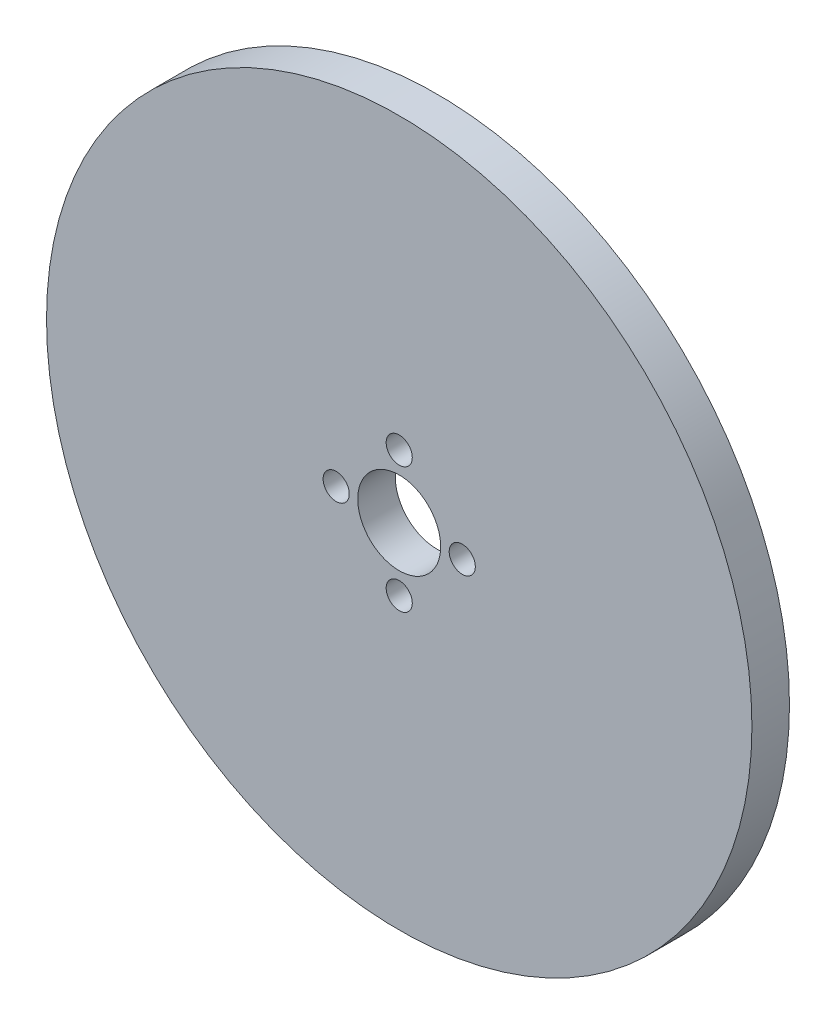
ISO-10303-21;
HEADER;
FILE_DESCRIPTION(('STEP AP214'),'2;1');
FILE_NAME('part.step','',(''),(''),'','','');
FILE_SCHEMA(('AUTOMOTIVE_DESIGN { 1 0 10303 214 1 1 1 1 }'));
ENDSEC;
DATA;
#1=APPLICATION_CONTEXT('core data for automotive mechanical design processes');
#2=APPLICATION_PROTOCOL_DEFINITION('international standard','automotive_design',2000,#1);
#3=PRODUCT_CONTEXT('',#1,'mechanical');
#4=PRODUCT('Part','Part','',(#3));
#5=PRODUCT_RELATED_PRODUCT_CATEGORY('part','',(#4));
#6=PRODUCT_DEFINITION_FORMATION('','',#4);
#7=PRODUCT_DEFINITION_CONTEXT('part definition',#1,'design');
#8=PRODUCT_DEFINITION('design','',#6,#7);
#9=PRODUCT_DEFINITION_SHAPE('','',#8);
#10=(LENGTH_UNIT() NAMED_UNIT(*) SI_UNIT(.MILLI.,.METRE.));
#11=(NAMED_UNIT(*) PLANE_ANGLE_UNIT() SI_UNIT($,.RADIAN.));
#12=(NAMED_UNIT(*) SI_UNIT($,.STERADIAN.) SOLID_ANGLE_UNIT());
#13=UNCERTAINTY_MEASURE_WITH_UNIT(LENGTH_MEASURE(1.E-05),#10,'distance_accuracy_value','');
#14=(GEOMETRIC_REPRESENTATION_CONTEXT(3) GLOBAL_UNCERTAINTY_ASSIGNED_CONTEXT((#13)) GLOBAL_UNIT_ASSIGNED_CONTEXT((#10,
#11,#12)) REPRESENTATION_CONTEXT('',''));
#15=CARTESIAN_POINT('',(0.,0.,0.));
#16=DIRECTION('',(0.,0.,1.));
#17=DIRECTION('',(1.,0.,0.));
#18=AXIS2_PLACEMENT_3D('',#15,#16,#17);
#19=CARTESIAN_POINT('',(0.,0.,-5.75));
#20=DIRECTION('',(0.,0.,1.));
#21=DIRECTION('',(1.,0.,0.));
#22=AXIS2_PLACEMENT_3D('',#19,#20,#21);
#23=CYLINDRICAL_SURFACE('',#22,54.);
#24=CARTESIAN_POINT('',(0.,0.,-5.75));
#25=DIRECTION('',(0.,0.,1.));
#26=DIRECTION('',(1.,0.,0.));
#27=AXIS2_PLACEMENT_3D('',#24,#25,#26);
#28=CIRCLE('',#27,54.);
#29=CARTESIAN_POINT('',(54.,0.,-5.75));
#30=VERTEX_POINT('',#29);
#31=EDGE_CURVE('E12',#30,#30,#28,.T.);
#32=ORIENTED_EDGE('',*,*,#31,.T.);
#33=EDGE_LOOP('',(#32));
#34=FACE_BOUND('',#33,.T.);
#35=CARTESIAN_POINT('',(0.,0.,0.));
#36=DIRECTION('',(0.,0.,1.));
#37=DIRECTION('',(1.,0.,0.));
#38=AXIS2_PLACEMENT_3D('',#35,#36,#37);
#39=CIRCLE('',#38,54.);
#40=CARTESIAN_POINT('',(54.,0.,0.));
#41=VERTEX_POINT('',#40);
#42=EDGE_CURVE('E79',#41,#41,#39,.T.);
#43=ORIENTED_EDGE('',*,*,#42,.F.);
#44=EDGE_LOOP('',(#43));
#45=FACE_BOUND('',#44,.T.);
#46=ADVANCED_FACE('F75',(#34,#45),#23,.T.);
#47=CARTESIAN_POINT('',(0.,0.,-5.75));
#48=DIRECTION('',(0.,0.,1.));
#49=DIRECTION('',(1.,0.,0.));
#50=AXIS2_PLACEMENT_3D('',#47,#48,#49);
#51=PLANE('',#50);
#52=CARTESIAN_POINT('',(0.,0.,-5.75));
#53=DIRECTION('',(0.,0.,-1.));
#54=DIRECTION('',(-1.,0.,0.));
#55=AXIS2_PLACEMENT_3D('',#52,#53,#54);
#56=CIRCLE('',#55,6.35);
#57=CARTESIAN_POINT('',(-6.35,0.,-5.75));
#58=VERTEX_POINT('',#57);
#59=EDGE_CURVE('E108',#58,#58,#56,.T.);
#60=ORIENTED_EDGE('',*,*,#59,.F.);
#61=EDGE_LOOP('',(#60));
#62=FACE_BOUND('',#61,.T.);
#63=CARTESIAN_POINT('',(9.64999999999999,0.,-5.75));
#64=DIRECTION('',(0.,0.,1.));
#65=DIRECTION('',(1.,0.,0.));
#66=AXIS2_PLACEMENT_3D('',#63,#64,#65);
#67=CIRCLE('',#66,2.);
#68=CARTESIAN_POINT('',(11.65,0.,-5.75));
#69=VERTEX_POINT('',#68);
#70=EDGE_CURVE('E123',#69,#69,#67,.T.);
#71=ORIENTED_EDGE('',*,*,#70,.T.);
#72=EDGE_LOOP('',(#71));
#73=FACE_BOUND('',#72,.T.);
#74=CARTESIAN_POINT('',(0.,-9.65,-5.75));
#75=DIRECTION('',(0.,0.,1.));
#76=DIRECTION('',(1.,0.,0.));
#77=AXIS2_PLACEMENT_3D('',#74,#75,#76);
#78=CIRCLE('',#77,2.);
#79=CARTESIAN_POINT('',(2.,-9.65,-5.75));
#80=VERTEX_POINT('',#79);
#81=EDGE_CURVE('E137',#80,#80,#78,.T.);
#82=ORIENTED_EDGE('',*,*,#81,.T.);
#83=EDGE_LOOP('',(#82));
#84=FACE_BOUND('',#83,.T.);
#85=CARTESIAN_POINT('',(0.,9.65,-5.75));
#86=DIRECTION('',(0.,0.,1.));
#87=DIRECTION('',(1.,0.,0.));
#88=AXIS2_PLACEMENT_3D('',#85,#86,#87);
#89=CIRCLE('',#88,2.);
#90=CARTESIAN_POINT('',(2.,9.65,-5.75));
#91=VERTEX_POINT('',#90);
#92=EDGE_CURVE('E139',#91,#91,#89,.T.);
#93=ORIENTED_EDGE('',*,*,#92,.T.);
#94=EDGE_LOOP('',(#93));
#95=FACE_BOUND('',#94,.T.);
#96=CARTESIAN_POINT('',(-9.65,0.,-5.75));
#97=DIRECTION('',(0.,0.,1.));
#98=DIRECTION('',(1.,0.,0.));
#99=AXIS2_PLACEMENT_3D('',#96,#97,#98);
#100=CIRCLE('',#99,2.);
#101=CARTESIAN_POINT('',(-7.65,0.,-5.75));
#102=VERTEX_POINT('',#101);
#103=EDGE_CURVE('E89',#102,#102,#100,.T.);
#104=ORIENTED_EDGE('',*,*,#103,.T.);
#105=EDGE_LOOP('',(#104));
#106=FACE_BOUND('',#105,.T.);
#107=ORIENTED_EDGE('',*,*,#31,.F.);
#108=EDGE_LOOP('',(#107));
#109=FACE_BOUND('',#108,.T.);
#110=ADVANCED_FACE('F169',(#62,#73,#84,#95,#106,#109),#51,.F.);
#111=CARTESIAN_POINT('',(0.,0.,0.));
#112=DIRECTION('',(0.,0.,1.));
#113=DIRECTION('',(1.,0.,0.));
#114=AXIS2_PLACEMENT_3D('',#111,#112,#113);
#115=PLANE('',#114);
#116=CARTESIAN_POINT('',(0.,0.,0.));
#117=DIRECTION('',(0.,0.,1.));
#118=DIRECTION('',(1.,0.,0.));
#119=AXIS2_PLACEMENT_3D('',#116,#117,#118);
#120=CIRCLE('',#119,6.35);
#121=CARTESIAN_POINT('',(-6.35,0.,0.));
#122=VERTEX_POINT('',#121);
#123=EDGE_CURVE('E114',#122,#122,#120,.F.);
#124=ORIENTED_EDGE('',*,*,#123,.T.);
#125=EDGE_LOOP('',(#124));
#126=FACE_BOUND('',#125,.T.);
#127=CARTESIAN_POINT('',(9.64999999999999,0.,0.));
#128=DIRECTION('',(0.,0.,1.));
#129=DIRECTION('',(1.,0.,0.));
#130=AXIS2_PLACEMENT_3D('',#127,#128,#129);
#131=CIRCLE('',#130,2.);
#132=CARTESIAN_POINT('',(11.65,0.,0.));
#133=VERTEX_POINT('',#132);
#134=EDGE_CURVE('E113',#133,#133,#131,.T.);
#135=ORIENTED_EDGE('',*,*,#134,.F.);
#136=EDGE_LOOP('',(#135));
#137=FACE_BOUND('',#136,.T.);
#138=CARTESIAN_POINT('',(0.,-9.65,0.));
#139=DIRECTION('',(0.,0.,1.));
#140=DIRECTION('',(1.,0.,0.));
#141=AXIS2_PLACEMENT_3D('',#138,#139,#140);
#142=CIRCLE('',#141,2.);
#143=CARTESIAN_POINT('',(2.,-9.65,0.));
#144=VERTEX_POINT('',#143);
#145=EDGE_CURVE('E127',#144,#144,#142,.T.);
#146=ORIENTED_EDGE('',*,*,#145,.F.);
#147=EDGE_LOOP('',(#146));
#148=FACE_BOUND('',#147,.T.);
#149=CARTESIAN_POINT('',(0.,9.65,0.));
#150=DIRECTION('',(0.,0.,1.));
#151=DIRECTION('',(1.,0.,0.));
#152=AXIS2_PLACEMENT_3D('',#149,#150,#151);
#153=CIRCLE('',#152,2.);
#154=CARTESIAN_POINT('',(2.,9.65,0.));
#155=VERTEX_POINT('',#154);
#156=EDGE_CURVE('E145',#155,#155,#153,.T.);
#157=ORIENTED_EDGE('',*,*,#156,.F.);
#158=EDGE_LOOP('',(#157));
#159=FACE_BOUND('',#158,.T.);
#160=CARTESIAN_POINT('',(-9.65,0.,0.));
#161=DIRECTION('',(0.,0.,1.));
#162=DIRECTION('',(1.,0.,0.));
#163=AXIS2_PLACEMENT_3D('',#160,#161,#162);
#164=CIRCLE('',#163,2.);
#165=CARTESIAN_POINT('',(-7.65,0.,0.));
#166=VERTEX_POINT('',#165);
#167=EDGE_CURVE('E91',#166,#166,#164,.T.);
#168=ORIENTED_EDGE('',*,*,#167,.F.);
#169=EDGE_LOOP('',(#168));
#170=FACE_BOUND('',#169,.T.);
#171=ORIENTED_EDGE('',*,*,#42,.T.);
#172=EDGE_LOOP('',(#171));
#173=FACE_BOUND('',#172,.T.);
#174=ADVANCED_FACE('F166',(#126,#137,#148,#159,#170,#173),#115,.T.);
#175=CARTESIAN_POINT('',(-9.65,0.,-5.75));
#176=DIRECTION('',(0.,0.,1.));
#177=DIRECTION('',(1.,0.,0.));
#178=AXIS2_PLACEMENT_3D('',#175,#176,#177);
#179=CYLINDRICAL_SURFACE('',#178,2.);
#180=ORIENTED_EDGE('',*,*,#103,.F.);
#181=EDGE_LOOP('',(#180));
#182=FACE_BOUND('',#181,.T.);
#183=ORIENTED_EDGE('',*,*,#167,.T.);
#184=EDGE_LOOP('',(#183));
#185=FACE_BOUND('',#184,.T.);
#186=ADVANCED_FACE('F164',(#182,#185),#179,.F.);
#187=CARTESIAN_POINT('',(0.,9.65,-5.75));
#188=DIRECTION('',(0.,0.,1.));
#189=DIRECTION('',(1.,0.,0.));
#190=AXIS2_PLACEMENT_3D('',#187,#188,#189);
#191=CYLINDRICAL_SURFACE('',#190,2.);
#192=ORIENTED_EDGE('',*,*,#92,.F.);
#193=EDGE_LOOP('',(#192));
#194=FACE_BOUND('',#193,.T.);
#195=ORIENTED_EDGE('',*,*,#156,.T.);
#196=EDGE_LOOP('',(#195));
#197=FACE_BOUND('',#196,.T.);
#198=ADVANCED_FACE('F189',(#194,#197),#191,.F.);
#199=CARTESIAN_POINT('',(0.,-9.65,-5.75));
#200=DIRECTION('',(0.,0.,1.));
#201=DIRECTION('',(1.,0.,0.));
#202=AXIS2_PLACEMENT_3D('',#199,#200,#201);
#203=CYLINDRICAL_SURFACE('',#202,2.);
#204=ORIENTED_EDGE('',*,*,#81,.F.);
#205=EDGE_LOOP('',(#204));
#206=FACE_BOUND('',#205,.T.);
#207=ORIENTED_EDGE('',*,*,#145,.T.);
#208=EDGE_LOOP('',(#207));
#209=FACE_BOUND('',#208,.T.);
#210=ADVANCED_FACE('F201',(#206,#209),#203,.F.);
#211=CARTESIAN_POINT('',(9.64999999999999,0.,-5.75));
#212=DIRECTION('',(0.,0.,1.));
#213=DIRECTION('',(1.,0.,0.));
#214=AXIS2_PLACEMENT_3D('',#211,#212,#213);
#215=CYLINDRICAL_SURFACE('',#214,2.);
#216=ORIENTED_EDGE('',*,*,#70,.F.);
#217=EDGE_LOOP('',(#216));
#218=FACE_BOUND('',#217,.T.);
#219=ORIENTED_EDGE('',*,*,#134,.T.);
#220=EDGE_LOOP('',(#219));
#221=FACE_BOUND('',#220,.T.);
#222=ADVANCED_FACE('F196',(#218,#221),#215,.F.);
#223=CARTESIAN_POINT('',(0.,0.,0.00100000000000013));
#224=DIRECTION('',(0.,0.,-1.));
#225=DIRECTION('',(-1.,0.,0.));
#226=AXIS2_PLACEMENT_3D('',#223,#224,#225);
#227=CYLINDRICAL_SURFACE('',#226,6.35);
#228=CARTESIAN_POINT('',(-6.35,0.,0.));
#229=CARTESIAN_POINT('',(-6.35,0.,-0.0598958333333332));
#230=CARTESIAN_POINT('',(-6.35,0.,-0.119791666666667));
#231=CARTESIAN_POINT('',(-6.35,0.,-0.239583333333333));
#232=CARTESIAN_POINT('',(-6.35,0.,-0.299479166666667));
#233=CARTESIAN_POINT('',(-6.35,0.,-0.419270833333333));
#234=CARTESIAN_POINT('',(-6.35,0.,-0.479166666666667));
#235=CARTESIAN_POINT('',(-6.35,0.,-0.598958333333333));
#236=CARTESIAN_POINT('',(-6.35,0.,-0.658854166666667));
#237=CARTESIAN_POINT('',(-6.35,0.,-0.778645833333333));
#238=CARTESIAN_POINT('',(-6.35,0.,-0.838541666666667));
#239=CARTESIAN_POINT('',(-6.35,0.,-0.958333333333333));
#240=CARTESIAN_POINT('',(-6.35,0.,-1.01822916666667));
#241=CARTESIAN_POINT('',(-6.35,0.,-1.13802083333333));
#242=CARTESIAN_POINT('',(-6.35,0.,-1.19791666666667));
#243=CARTESIAN_POINT('',(-6.35,0.,-1.31770833333333));
#244=CARTESIAN_POINT('',(-6.35,0.,-1.37760416666667));
#245=CARTESIAN_POINT('',(-6.35,0.,-1.49739583333333));
#246=CARTESIAN_POINT('',(-6.35,0.,-1.55729166666667));
#247=CARTESIAN_POINT('',(-6.35,0.,-1.67708333333333));
#248=CARTESIAN_POINT('',(-6.35,0.,-1.73697916666667));
#249=CARTESIAN_POINT('',(-6.35,0.,-1.85677083333333));
#250=CARTESIAN_POINT('',(-6.35,0.,-1.91666666666667));
#251=CARTESIAN_POINT('',(-6.35,0.,-2.03645833333333));
#252=CARTESIAN_POINT('',(-6.35,0.,-2.09635416666667));
#253=CARTESIAN_POINT('',(-6.35,0.,-2.21614583333333));
#254=CARTESIAN_POINT('',(-6.35,0.,-2.27604166666667));
#255=CARTESIAN_POINT('',(-6.35,0.,-2.39583333333333));
#256=CARTESIAN_POINT('',(-6.35,0.,-2.45572916666667));
#257=CARTESIAN_POINT('',(-6.35,0.,-2.57552083333333));
#258=CARTESIAN_POINT('',(-6.35,0.,-2.63541666666667));
#259=CARTESIAN_POINT('',(-6.35,0.,-2.75520833333333));
#260=CARTESIAN_POINT('',(-6.35,0.,-2.81510416666667));
#261=CARTESIAN_POINT('',(-6.35,0.,-2.93489583333333));
#262=CARTESIAN_POINT('',(-6.35,0.,-2.99479166666667));
#263=CARTESIAN_POINT('',(-6.35,0.,-3.11458333333333));
#264=CARTESIAN_POINT('',(-6.35,0.,-3.17447916666667));
#265=CARTESIAN_POINT('',(-6.35,0.,-3.29427083333333));
#266=CARTESIAN_POINT('',(-6.35,0.,-3.35416666666667));
#267=CARTESIAN_POINT('',(-6.35,0.,-3.47395833333333));
#268=CARTESIAN_POINT('',(-6.35,0.,-3.53385416666667));
#269=CARTESIAN_POINT('',(-6.35,0.,-3.65364583333333));
#270=CARTESIAN_POINT('',(-6.35,0.,-3.71354166666667));
#271=CARTESIAN_POINT('',(-6.35,0.,-3.83333333333333));
#272=CARTESIAN_POINT('',(-6.35,0.,-3.89322916666667));
#273=CARTESIAN_POINT('',(-6.35,0.,-4.01302083333333));
#274=CARTESIAN_POINT('',(-6.35,0.,-4.07291666666667));
#275=CARTESIAN_POINT('',(-6.35,0.,-4.19270833333333));
#276=CARTESIAN_POINT('',(-6.35,0.,-4.25260416666667));
#277=CARTESIAN_POINT('',(-6.35,0.,-4.37239583333333));
#278=CARTESIAN_POINT('',(-6.35,0.,-4.43229166666667));
#279=CARTESIAN_POINT('',(-6.35,0.,-4.55208333333333));
#280=CARTESIAN_POINT('',(-6.35,0.,-4.61197916666667));
#281=CARTESIAN_POINT('',(-6.35,0.,-4.73177083333333));
#282=CARTESIAN_POINT('',(-6.35,0.,-4.79166666666667));
#283=CARTESIAN_POINT('',(-6.35,0.,-4.91145833333333));
#284=CARTESIAN_POINT('',(-6.35,0.,-4.97135416666667));
#285=CARTESIAN_POINT('',(-6.35,0.,-5.09114583333333));
#286=CARTESIAN_POINT('',(-6.35,0.,-5.15104166666667));
#287=CARTESIAN_POINT('',(-6.35,0.,-5.27083333333333));
#288=CARTESIAN_POINT('',(-6.35,0.,-5.33072916666667));
#289=CARTESIAN_POINT('',(-6.35,0.,-5.45052083333333));
#290=CARTESIAN_POINT('',(-6.35,0.,-5.51041666666667));
#291=CARTESIAN_POINT('',(-6.35,0.,-5.63020833333333));
#292=CARTESIAN_POINT('',(-6.35,0.,-5.69010416666667));
#293=CARTESIAN_POINT('',(-6.35,0.,-5.75));
#294=B_SPLINE_CURVE_WITH_KNOTS('',3,(#228,#229,#230,#231,#232,#233,#234,#235,#236,#237,#238,
#239,#240,#241,#242,#243,#244,#245,#246,#247,#248,#249,#250,#251,#252,#253,#254,#255,#256,#257,
#258,#259,#260,#261,#262,#263,#264,#265,#266,#267,#268,#269,#270,#271,#272,#273,#274,#275,#276,
#277,#278,#279,#280,#281,#282,#283,#284,#285,#286,#287,#288,#289,#290,#291,#292,#293),
.UNSPECIFIED.,.F.,.F.,(4,2,2,2,2,2,2,2,2,2,2,2,2,2,2,2,2,2,2,2,2,2,2,2,2,2,2,2,2,2,2,2,4),(0.,
0.1796875,0.359375,0.5390625,0.71875,0.8984375,1.078125,1.2578125,1.4375,1.6171875,1.796875,
1.9765625,2.15625,2.3359375,2.515625,2.6953125,2.875,3.0546875,3.234375,3.4140625,3.59375,
3.7734375,3.953125,4.1328125,4.3125,4.4921875,4.671875,4.8515625,5.03125,5.2109375,5.390625,
5.5703125,5.75),.UNSPECIFIED.);
#295=EDGE_CURVE('BSEAM193',#122,#58,#294,.T.);
#296=ORIENTED_EDGE('',*,*,#123,.F.);
#297=ORIENTED_EDGE('',*,*,#59,.T.);
#298=ORIENTED_EDGE('',*,*,#295,.T.);
#299=ORIENTED_EDGE('',*,*,#295,.F.);
#300=EDGE_LOOP('',(#296,#298,#297,#299));
#301=FACE_BOUND('',#300,.T.);
#302=ADVANCED_FACE('F193',(#301),#227,.F.);
#303=CLOSED_SHELL('',(#46,#110,#174,#186,#198,#210,#222,#302));
#304=MANIFOLD_SOLID_BREP('B2',#303);
#305=ADVANCED_BREP_SHAPE_REPRESENTATION('',(#18,#304),#14);
#306=SHAPE_DEFINITION_REPRESENTATION(#9,#305);
ENDSEC;
END-ISO-10303-21;
